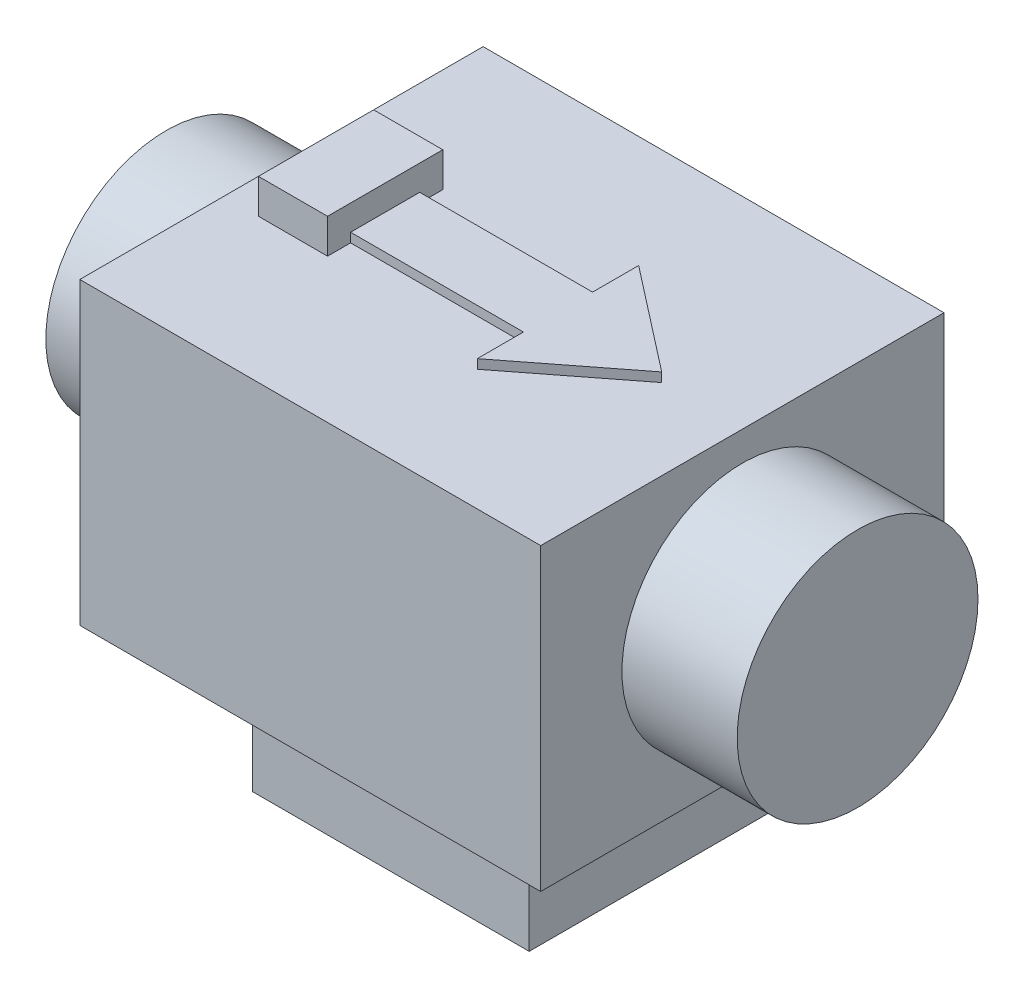
ISO-10303-21;
HEADER;
FILE_DESCRIPTION(('STEP AP214'),'2;1');
FILE_NAME('part.step','',(''),(''),'','','');
FILE_SCHEMA(('AUTOMOTIVE_DESIGN { 1 0 10303 214 1 1 1 1 }'));
ENDSEC;
DATA;
#1=APPLICATION_CONTEXT('core data for automotive mechanical design processes');
#2=APPLICATION_PROTOCOL_DEFINITION('international standard','automotive_design',2000,#1);
#3=PRODUCT_CONTEXT('',#1,'mechanical');
#4=PRODUCT('Part','Part','',(#3));
#5=PRODUCT_RELATED_PRODUCT_CATEGORY('part','',(#4));
#6=PRODUCT_DEFINITION_FORMATION('','',#4);
#7=PRODUCT_DEFINITION_CONTEXT('part definition',#1,'design');
#8=PRODUCT_DEFINITION('design','',#6,#7);
#9=PRODUCT_DEFINITION_SHAPE('','',#8);
#10=(LENGTH_UNIT() NAMED_UNIT(*) SI_UNIT(.MILLI.,.METRE.));
#11=(NAMED_UNIT(*) PLANE_ANGLE_UNIT() SI_UNIT($,.RADIAN.));
#12=(NAMED_UNIT(*) SI_UNIT($,.STERADIAN.) SOLID_ANGLE_UNIT());
#13=UNCERTAINTY_MEASURE_WITH_UNIT(LENGTH_MEASURE(1.E-05),#10,'distance_accuracy_value','');
#14=(GEOMETRIC_REPRESENTATION_CONTEXT(3) GLOBAL_UNCERTAINTY_ASSIGNED_CONTEXT((#13)) GLOBAL_UNIT_ASSIGNED_CONTEXT((#10,
#11,#12)) REPRESENTATION_CONTEXT('',''));
#15=CARTESIAN_POINT('',(0.,0.,0.));
#16=DIRECTION('',(0.,0.,1.));
#17=DIRECTION('',(1.,0.,0.));
#18=AXIS2_PLACEMENT_3D('',#15,#16,#17);
#19=CARTESIAN_POINT('',(0.,38.,0.));
#20=DIRECTION('',(0.,-1.,0.));
#21=DIRECTION('',(0.,0.,-1.));
#22=AXIS2_PLACEMENT_3D('',#19,#20,#21);
#23=PLANE('',#22);
#24=DIRECTION('',(0.,0.,-1.));
#25=VECTOR('',#24,1.);
#26=CARTESIAN_POINT('',(20.,38.,17.5));
#27=LINE('',#26,#25);
#28=CARTESIAN_POINT('',(20.,38.,17.5));
#29=VERTEX_POINT('',#28);
#30=CARTESIAN_POINT('',(20.,38.,-17.5));
#31=VERTEX_POINT('',#30);
#32=EDGE_CURVE('E342',#29,#31,#27,.T.);
#33=ORIENTED_EDGE('',*,*,#32,.T.);
#34=DIRECTION('',(-1.,0.,0.));
#35=VECTOR('',#34,1.);
#36=CARTESIAN_POINT('',(-20.,38.,-17.5));
#37=LINE('',#36,#35);
#38=CARTESIAN_POINT('',(-20.,38.,-17.5));
#39=VERTEX_POINT('',#38);
#40=EDGE_CURVE('E350',#31,#39,#37,.T.);
#41=ORIENTED_EDGE('',*,*,#40,.T.);
#42=DIRECTION('',(0.,0.,1.));
#43=VECTOR('',#42,1.);
#44=CARTESIAN_POINT('',(-20.,38.,17.5));
#45=LINE('',#44,#43);
#46=CARTESIAN_POINT('',(-20.,38.,17.5));
#47=VERTEX_POINT('',#46);
#48=EDGE_CURVE('E351',#39,#47,#45,.T.);
#49=ORIENTED_EDGE('',*,*,#48,.T.);
#50=DIRECTION('',(1.,0.,0.));
#51=VECTOR('',#50,1.);
#52=CARTESIAN_POINT('',(-20.,38.,17.5));
#53=LINE('',#52,#51);
#54=EDGE_CURVE('E353',#47,#29,#53,.T.);
#55=ORIENTED_EDGE('',*,*,#54,.T.);
#56=EDGE_LOOP('',(#33,#41,#49,#55));
#57=FACE_BOUND('',#56,.T.);
#58=DIRECTION('',(0.,0.,-1.));
#59=VECTOR('',#58,1.);
#60=CARTESIAN_POINT('',(-11.,38.,5.));
#61=LINE('',#60,#59);
#62=CARTESIAN_POINT('',(-11.,38.,-3.));
#63=VERTEX_POINT('',#62);
#64=CARTESIAN_POINT('',(-11.,38.,-5.));
#65=VERTEX_POINT('',#64);
#66=EDGE_CURVE('E202',#63,#65,#61,.T.);
#67=ORIENTED_EDGE('',*,*,#66,.F.);
#68=DIRECTION('',(-1.,0.,0.));
#69=VECTOR('',#68,1.);
#70=CARTESIAN_POINT('',(-12.,38.,-3.));
#71=LINE('',#70,#69);
#72=CARTESIAN_POINT('',(4.,38.,-3.));
#73=VERTEX_POINT('',#72);
#74=EDGE_CURVE('E223',#73,#63,#71,.T.);
#75=ORIENTED_EDGE('',*,*,#74,.F.);
#76=DIRECTION('',(0.,0.,1.));
#77=VECTOR('',#76,1.);
#78=CARTESIAN_POINT('',(4.,38.,-3.));
#79=LINE('',#78,#77);
#80=CARTESIAN_POINT('',(4.,38.,-7.));
#81=VERTEX_POINT('',#80);
#82=EDGE_CURVE('E254',#81,#73,#79,.T.);
#83=ORIENTED_EDGE('',*,*,#82,.F.);
#84=DIRECTION('',(-0.789352217376326,0.,-0.61394061351492));
#85=VECTOR('',#84,1.);
#86=CARTESIAN_POINT('',(4.,38.,-7.));
#87=LINE('',#86,#85);
#88=CARTESIAN_POINT('',(13.,38.,0.));
#89=VERTEX_POINT('',#88);
#90=EDGE_CURVE('E253',#89,#81,#87,.T.);
#91=ORIENTED_EDGE('',*,*,#90,.F.);
#92=DIRECTION('',(0.789352217376326,0.,-0.61394061351492));
#93=VECTOR('',#92,1.);
#94=CARTESIAN_POINT('',(13.,38.,0.));
#95=LINE('',#94,#93);
#96=CARTESIAN_POINT('',(4.,38.,7.));
#97=VERTEX_POINT('',#96);
#98=EDGE_CURVE('E250',#97,#89,#95,.T.);
#99=ORIENTED_EDGE('',*,*,#98,.F.);
#100=DIRECTION('',(0.,0.,1.));
#101=VECTOR('',#100,1.);
#102=CARTESIAN_POINT('',(4.,38.,7.));
#103=LINE('',#102,#101);
#104=CARTESIAN_POINT('',(4.,38.,3.));
#105=VERTEX_POINT('',#104);
#106=EDGE_CURVE('E244',#105,#97,#103,.T.);
#107=ORIENTED_EDGE('',*,*,#106,.F.);
#108=DIRECTION('',(1.,0.,0.));
#109=VECTOR('',#108,1.);
#110=CARTESIAN_POINT('',(4.,38.,3.));
#111=LINE('',#110,#109);
#112=CARTESIAN_POINT('',(-11.,38.,3.));
#113=VERTEX_POINT('',#112);
#114=EDGE_CURVE('E219',#113,#105,#111,.T.);
#115=ORIENTED_EDGE('',*,*,#114,.F.);
#116=CARTESIAN_POINT('',(-11.,38.,5.));
#117=VERTEX_POINT('',#116);
#118=EDGE_CURVE('E406',#117,#113,#61,.T.);
#119=ORIENTED_EDGE('',*,*,#118,.F.);
#120=DIRECTION('',(1.,0.,0.));
#121=VECTOR('',#120,1.);
#122=CARTESIAN_POINT('',(-17.,38.,5.));
#123=LINE('',#122,#121);
#124=CARTESIAN_POINT('',(-17.,38.,5.));
#125=VERTEX_POINT('',#124);
#126=EDGE_CURVE('E199',#125,#117,#123,.T.);
#127=ORIENTED_EDGE('',*,*,#126,.F.);
#128=DIRECTION('',(0.,0.,1.));
#129=VECTOR('',#128,1.);
#130=CARTESIAN_POINT('',(-17.,38.,5.));
#131=LINE('',#130,#129);
#132=CARTESIAN_POINT('',(-17.,38.,-5.));
#133=VERTEX_POINT('',#132);
#134=EDGE_CURVE('E69',#133,#125,#131,.T.);
#135=ORIENTED_EDGE('',*,*,#134,.F.);
#136=DIRECTION('',(-1.,0.,0.));
#137=VECTOR('',#136,1.);
#138=CARTESIAN_POINT('',(-17.,38.,-5.));
#139=LINE('',#138,#137);
#140=EDGE_CURVE('E65',#65,#133,#139,.T.);
#141=ORIENTED_EDGE('',*,*,#140,.F.);
#142=EDGE_LOOP('',(#67,#75,#83,#91,#99,#107,#115,#119,#127,#135,#141));
#143=FACE_BOUND('',#142,.T.);
#144=ADVANCED_FACE('F47',(#57,#143),#23,.F.);
#145=CARTESIAN_POINT('',(4.,38.8,3.));
#146=DIRECTION('',(0.,0.,-1.));
#147=DIRECTION('',(-1.,0.,0.));
#148=AXIS2_PLACEMENT_3D('',#145,#146,#147);
#149=PLANE('',#148);
#150=DIRECTION('',(0.,1.,0.));
#151=VECTOR('',#150,1.);
#152=CARTESIAN_POINT('',(-11.,38.8,3.));
#153=LINE('',#152,#151);
#154=CARTESIAN_POINT('',(-11.,38.8,3.));
#155=VERTEX_POINT('',#154);
#156=EDGE_CURVE('E211',#113,#155,#153,.T.);
#157=ORIENTED_EDGE('',*,*,#156,.F.);
#158=ORIENTED_EDGE('',*,*,#114,.T.);
#159=DIRECTION('',(0.,-1.,0.));
#160=VECTOR('',#159,1.);
#161=CARTESIAN_POINT('',(4.,38.8,3.));
#162=LINE('',#161,#160);
#163=CARTESIAN_POINT('',(4.,38.8,3.));
#164=VERTEX_POINT('',#163);
#165=EDGE_CURVE('E280',#164,#105,#162,.T.);
#166=ORIENTED_EDGE('',*,*,#165,.F.);
#167=DIRECTION('',(1.,0.,0.));
#168=VECTOR('',#167,1.);
#169=CARTESIAN_POINT('',(4.,38.8,3.));
#170=LINE('',#169,#168);
#171=EDGE_CURVE('E222',#155,#164,#170,.T.);
#172=ORIENTED_EDGE('',*,*,#171,.F.);
#173=EDGE_LOOP('',(#157,#158,#166,#172));
#174=FACE_BOUND('',#173,.T.);
#175=ADVANCED_FACE('F401',(#174),#149,.F.);
#176=CARTESIAN_POINT('',(-12.,38.8,-3.));
#177=DIRECTION('',(0.,0.,1.));
#178=DIRECTION('',(1.,0.,0.));
#179=AXIS2_PLACEMENT_3D('',#176,#177,#178);
#180=PLANE('',#179);
#181=DIRECTION('',(0.,-1.,0.));
#182=VECTOR('',#181,1.);
#183=CARTESIAN_POINT('',(-11.,38.8,-3.));
#184=LINE('',#183,#182);
#185=CARTESIAN_POINT('',(-11.,38.8,-3.));
#186=VERTEX_POINT('',#185);
#187=EDGE_CURVE('E210',#186,#63,#184,.T.);
#188=ORIENTED_EDGE('',*,*,#187,.F.);
#189=DIRECTION('',(-1.,0.,0.));
#190=VECTOR('',#189,1.);
#191=CARTESIAN_POINT('',(-12.,38.8,-3.));
#192=LINE('',#191,#190);
#193=CARTESIAN_POINT('',(4.,38.8,-3.));
#194=VERTEX_POINT('',#193);
#195=EDGE_CURVE('E240',#194,#186,#192,.T.);
#196=ORIENTED_EDGE('',*,*,#195,.F.);
#197=DIRECTION('',(0.,-1.,0.));
#198=VECTOR('',#197,1.);
#199=CARTESIAN_POINT('',(4.,38.8,-3.));
#200=LINE('',#199,#198);
#201=EDGE_CURVE('E238',#194,#73,#200,.T.);
#202=ORIENTED_EDGE('',*,*,#201,.T.);
#203=ORIENTED_EDGE('',*,*,#74,.T.);
#204=EDGE_LOOP('',(#188,#196,#202,#203));
#205=FACE_BOUND('',#204,.T.);
#206=ADVANCED_FACE('F410',(#205),#180,.F.);
#207=CARTESIAN_POINT('',(0.,38.8,0.));
#208=DIRECTION('',(0.,-1.,0.));
#209=DIRECTION('',(0.,0.,-1.));
#210=AXIS2_PLACEMENT_3D('',#207,#208,#209);
#211=PLANE('',#210);
#212=DIRECTION('',(0.,0.,-1.));
#213=VECTOR('',#212,1.);
#214=CARTESIAN_POINT('',(-11.,38.8,0.));
#215=LINE('',#214,#213);
#216=EDGE_CURVE('E11',#155,#186,#215,.T.);
#217=ORIENTED_EDGE('',*,*,#216,.F.);
#218=ORIENTED_EDGE('',*,*,#171,.T.);
#219=DIRECTION('',(0.,0.,1.));
#220=VECTOR('',#219,1.);
#221=CARTESIAN_POINT('',(4.,38.8,7.));
#222=LINE('',#221,#220);
#223=CARTESIAN_POINT('',(4.,38.8,7.));
#224=VERTEX_POINT('',#223);
#225=EDGE_CURVE('E221',#164,#224,#222,.T.);
#226=ORIENTED_EDGE('',*,*,#225,.T.);
#227=DIRECTION('',(0.789352217376326,0.,-0.61394061351492));
#228=VECTOR('',#227,1.);
#229=CARTESIAN_POINT('',(13.,38.8,0.));
#230=LINE('',#229,#228);
#231=CARTESIAN_POINT('',(13.,38.8,0.));
#232=VERTEX_POINT('',#231);
#233=EDGE_CURVE('E229',#224,#232,#230,.T.);
#234=ORIENTED_EDGE('',*,*,#233,.T.);
#235=DIRECTION('',(-0.789352217376326,0.,-0.61394061351492));
#236=VECTOR('',#235,1.);
#237=CARTESIAN_POINT('',(4.,38.8,-7.));
#238=LINE('',#237,#236);
#239=CARTESIAN_POINT('',(4.,38.8,-7.));
#240=VERTEX_POINT('',#239);
#241=EDGE_CURVE('E231',#232,#240,#238,.T.);
#242=ORIENTED_EDGE('',*,*,#241,.T.);
#243=DIRECTION('',(0.,0.,1.));
#244=VECTOR('',#243,1.);
#245=CARTESIAN_POINT('',(4.,38.8,-3.));
#246=LINE('',#245,#244);
#247=EDGE_CURVE('E233',#240,#194,#246,.T.);
#248=ORIENTED_EDGE('',*,*,#247,.T.);
#249=ORIENTED_EDGE('',*,*,#195,.T.);
#250=EDGE_LOOP('',(#217,#218,#226,#234,#242,#248,#249));
#251=FACE_BOUND('',#250,.T.);
#252=ADVANCED_FACE('F414',(#251),#211,.F.);
#253=CARTESIAN_POINT('',(0.,12.,0.));
#254=DIRECTION('',(0.,-1.,0.));
#255=DIRECTION('',(0.,0.,-1.));
#256=AXIS2_PLACEMENT_3D('',#253,#254,#255);
#257=PLANE('',#256);
#258=DIRECTION('',(0.,0.,-1.));
#259=VECTOR('',#258,1.);
#260=CARTESIAN_POINT('',(20.,12.,17.5));
#261=LINE('',#260,#259);
#262=CARTESIAN_POINT('',(20.,12.,17.5));
#263=VERTEX_POINT('',#262);
#264=CARTESIAN_POINT('',(20.,12.,-17.5));
#265=VERTEX_POINT('',#264);
#266=EDGE_CURVE('E338',#263,#265,#261,.T.);
#267=ORIENTED_EDGE('',*,*,#266,.F.);
#268=DIRECTION('',(1.,0.,0.));
#269=VECTOR('',#268,1.);
#270=CARTESIAN_POINT('',(-20.,12.,17.5));
#271=LINE('',#270,#269);
#272=CARTESIAN_POINT('',(-20.,12.,17.5));
#273=VERTEX_POINT('',#272);
#274=EDGE_CURVE('E346',#273,#263,#271,.T.);
#275=ORIENTED_EDGE('',*,*,#274,.F.);
#276=DIRECTION('',(0.,0.,1.));
#277=VECTOR('',#276,1.);
#278=CARTESIAN_POINT('',(-20.,12.,17.5));
#279=LINE('',#278,#277);
#280=CARTESIAN_POINT('',(-20.,12.,-17.5));
#281=VERTEX_POINT('',#280);
#282=EDGE_CURVE('E365',#281,#273,#279,.T.);
#283=ORIENTED_EDGE('',*,*,#282,.F.);
#284=DIRECTION('',(-1.,0.,0.));
#285=VECTOR('',#284,1.);
#286=CARTESIAN_POINT('',(-20.,12.,-17.5));
#287=LINE('',#286,#285);
#288=EDGE_CURVE('E363',#265,#281,#287,.T.);
#289=ORIENTED_EDGE('',*,*,#288,.F.);
#290=EDGE_LOOP('',(#267,#275,#283,#289));
#291=FACE_BOUND('',#290,.T.);
#292=DIRECTION('',(1.,0.,0.));
#293=VECTOR('',#292,1.);
#294=CARTESIAN_POINT('',(-12.,12.,10.5));
#295=LINE('',#294,#293);
#296=CARTESIAN_POINT('',(-12.,12.,10.5));
#297=VERTEX_POINT('',#296);
#298=CARTESIAN_POINT('',(12.,12.,10.5));
#299=VERTEX_POINT('',#298);
#300=EDGE_CURVE('E293',#297,#299,#295,.T.);
#301=ORIENTED_EDGE('',*,*,#300,.T.);
#302=DIRECTION('',(0.,0.,-1.));
#303=VECTOR('',#302,1.);
#304=CARTESIAN_POINT('',(12.,12.,10.5));
#305=LINE('',#304,#303);
#306=CARTESIAN_POINT('',(12.,12.,-10.5));
#307=VERTEX_POINT('',#306);
#308=EDGE_CURVE('E282',#299,#307,#305,.T.);
#309=ORIENTED_EDGE('',*,*,#308,.T.);
#310=DIRECTION('',(-1.,0.,0.));
#311=VECTOR('',#310,1.);
#312=CARTESIAN_POINT('',(-12.,12.,-10.5));
#313=LINE('',#312,#311);
#314=CARTESIAN_POINT('',(-12.,12.,-10.5));
#315=VERTEX_POINT('',#314);
#316=EDGE_CURVE('E286',#307,#315,#313,.T.);
#317=ORIENTED_EDGE('',*,*,#316,.T.);
#318=DIRECTION('',(0.,0.,1.));
#319=VECTOR('',#318,1.);
#320=CARTESIAN_POINT('',(-12.,12.,10.5));
#321=LINE('',#320,#319);
#322=EDGE_CURVE('E292',#315,#297,#321,.T.);
#323=ORIENTED_EDGE('',*,*,#322,.T.);
#324=EDGE_LOOP('',(#301,#309,#317,#323));
#325=FACE_BOUND('',#324,.T.);
#326=ADVANCED_FACE('F391',(#291,#325),#257,.T.);
#327=CARTESIAN_POINT('',(20.,38.,17.5));
#328=DIRECTION('',(-1.,0.,0.));
#329=DIRECTION('',(0.,0.,1.));
#330=AXIS2_PLACEMENT_3D('',#327,#328,#329);
#331=PLANE('',#330);
#332=CARTESIAN_POINT('',(20.,25.,0.));
#333=DIRECTION('',(1.,0.,0.));
#334=DIRECTION('',(0.,0.,-1.));
#335=AXIS2_PLACEMENT_3D('',#332,#333,#334);
#336=CIRCLE('',#335,10.45);
#337=CARTESIAN_POINT('',(20.,25.,-10.45));
#338=VERTEX_POINT('',#337);
#339=EDGE_CURVE('E59',#338,#338,#336,.T.);
#340=ORIENTED_EDGE('',*,*,#339,.F.);
#341=EDGE_LOOP('',(#340));
#342=FACE_BOUND('',#341,.T.);
#343=ORIENTED_EDGE('',*,*,#266,.T.);
#344=DIRECTION('',(0.,-1.,0.));
#345=VECTOR('',#344,1.);
#346=CARTESIAN_POINT('',(20.,38.,-17.5));
#347=LINE('',#346,#345);
#348=EDGE_CURVE('E331',#31,#265,#347,.T.);
#349=ORIENTED_EDGE('',*,*,#348,.F.);
#350=ORIENTED_EDGE('',*,*,#32,.F.);
#351=DIRECTION('',(0.,-1.,0.));
#352=VECTOR('',#351,1.);
#353=CARTESIAN_POINT('',(20.,38.,17.5));
#354=LINE('',#353,#352);
#355=EDGE_CURVE('E360',#29,#263,#354,.T.);
#356=ORIENTED_EDGE('',*,*,#355,.T.);
#357=EDGE_LOOP('',(#343,#349,#350,#356));
#358=FACE_BOUND('',#357,.T.);
#359=ADVANCED_FACE('F51',(#342,#358),#331,.F.);
#360=CARTESIAN_POINT('',(-20.,38.,-17.5));
#361=DIRECTION('',(0.,0.,1.));
#362=DIRECTION('',(1.,0.,0.));
#363=AXIS2_PLACEMENT_3D('',#360,#361,#362);
#364=PLANE('',#363);
#365=ORIENTED_EDGE('',*,*,#288,.T.);
#366=DIRECTION('',(0.,-1.,0.));
#367=VECTOR('',#366,1.);
#368=CARTESIAN_POINT('',(-20.,38.,-17.5));
#369=LINE('',#368,#367);
#370=EDGE_CURVE('E376',#39,#281,#369,.T.);
#371=ORIENTED_EDGE('',*,*,#370,.F.);
#372=ORIENTED_EDGE('',*,*,#40,.F.);
#373=ORIENTED_EDGE('',*,*,#348,.T.);
#374=EDGE_LOOP('',(#365,#371,#372,#373));
#375=FACE_BOUND('',#374,.T.);
#376=ADVANCED_FACE('F382',(#375),#364,.F.);
#377=CARTESIAN_POINT('',(-20.,38.,17.5));
#378=DIRECTION('',(1.,0.,0.));
#379=DIRECTION('',(0.,0.,-1.));
#380=AXIS2_PLACEMENT_3D('',#377,#378,#379);
#381=PLANE('',#380);
#382=CARTESIAN_POINT('',(-20.,25.,0.));
#383=DIRECTION('',(1.,0.,0.));
#384=DIRECTION('',(0.,0.,-1.));
#385=AXIS2_PLACEMENT_3D('',#382,#383,#384);
#386=CIRCLE('',#385,10.45);
#387=CARTESIAN_POINT('',(-20.,25.,-10.45));
#388=VERTEX_POINT('',#387);
#389=EDGE_CURVE('E333',#388,#388,#386,.T.);
#390=ORIENTED_EDGE('',*,*,#389,.T.);
#391=EDGE_LOOP('',(#390));
#392=FACE_BOUND('',#391,.T.);
#393=ORIENTED_EDGE('',*,*,#282,.T.);
#394=DIRECTION('',(0.,-1.,0.));
#395=VECTOR('',#394,1.);
#396=CARTESIAN_POINT('',(-20.,38.,17.5));
#397=LINE('',#396,#395);
#398=EDGE_CURVE('E375',#47,#273,#397,.T.);
#399=ORIENTED_EDGE('',*,*,#398,.F.);
#400=ORIENTED_EDGE('',*,*,#48,.F.);
#401=ORIENTED_EDGE('',*,*,#370,.T.);
#402=EDGE_LOOP('',(#393,#399,#400,#401));
#403=FACE_BOUND('',#402,.T.);
#404=ADVANCED_FACE('F396',(#392,#403),#381,.F.);
#405=CARTESIAN_POINT('',(-20.,38.,17.5));
#406=DIRECTION('',(0.,0.,-1.));
#407=DIRECTION('',(-1.,0.,0.));
#408=AXIS2_PLACEMENT_3D('',#405,#406,#407);
#409=PLANE('',#408);
#410=ORIENTED_EDGE('',*,*,#274,.T.);
#411=ORIENTED_EDGE('',*,*,#355,.F.);
#412=ORIENTED_EDGE('',*,*,#54,.F.);
#413=ORIENTED_EDGE('',*,*,#398,.T.);
#414=EDGE_LOOP('',(#410,#411,#412,#413));
#415=FACE_BOUND('',#414,.T.);
#416=ADVANCED_FACE('F399',(#415),#409,.F.);
#417=CARTESIAN_POINT('',(-20.,25.,0.));
#418=DIRECTION('',(-1.,0.,0.));
#419=DIRECTION('',(0.,0.,1.));
#420=AXIS2_PLACEMENT_3D('',#417,#418,#419);
#421=CYLINDRICAL_SURFACE('',#420,10.45);
#422=ORIENTED_EDGE('',*,*,#389,.F.);
#423=EDGE_LOOP('',(#422));
#424=FACE_BOUND('',#423,.T.);
#425=CARTESIAN_POINT('',(-30.,25.,0.));
#426=DIRECTION('',(1.,0.,0.));
#427=DIRECTION('',(0.,0.,-1.));
#428=AXIS2_PLACEMENT_3D('',#425,#426,#427);
#429=CIRCLE('',#428,10.45);
#430=CARTESIAN_POINT('',(-30.,25.,-10.45));
#431=VERTEX_POINT('',#430);
#432=EDGE_CURVE('E329',#431,#431,#429,.T.);
#433=ORIENTED_EDGE('',*,*,#432,.T.);
#434=EDGE_LOOP('',(#433));
#435=FACE_BOUND('',#434,.T.);
#436=ADVANCED_FACE('F514',(#424,#435),#421,.T.);
#437=CARTESIAN_POINT('',(-30.,25.,0.));
#438=DIRECTION('',(1.,0.,0.));
#439=DIRECTION('',(0.,0.,-1.));
#440=AXIS2_PLACEMENT_3D('',#437,#438,#439);
#441=PLANE('',#440);
#442=ORIENTED_EDGE('',*,*,#432,.F.);
#443=EDGE_LOOP('',(#442));
#444=FACE_BOUND('',#443,.T.);
#445=ADVANCED_FACE('F509',(#444),#441,.F.);
#446=CARTESIAN_POINT('',(30.,25.,0.));
#447=DIRECTION('',(-1.,0.,0.));
#448=DIRECTION('',(0.,0.,1.));
#449=AXIS2_PLACEMENT_3D('',#446,#447,#448);
#450=CYLINDRICAL_SURFACE('',#449,10.45);
#451=CARTESIAN_POINT('',(30.,25.,0.));
#452=DIRECTION('',(1.,0.,0.));
#453=DIRECTION('',(0.,0.,-1.));
#454=AXIS2_PLACEMENT_3D('',#451,#452,#453);
#455=CIRCLE('',#454,10.45);
#456=CARTESIAN_POINT('',(30.,25.,-10.45));
#457=VERTEX_POINT('',#456);
#458=EDGE_CURVE('E326',#457,#457,#455,.T.);
#459=ORIENTED_EDGE('',*,*,#458,.F.);
#460=EDGE_LOOP('',(#459));
#461=FACE_BOUND('',#460,.T.);
#462=ORIENTED_EDGE('',*,*,#339,.T.);
#463=EDGE_LOOP('',(#462));
#464=FACE_BOUND('',#463,.T.);
#465=ADVANCED_FACE('F506',(#461,#464),#450,.T.);
#466=CARTESIAN_POINT('',(30.,25.,0.));
#467=DIRECTION('',(1.,0.,0.));
#468=DIRECTION('',(0.,0.,-1.));
#469=AXIS2_PLACEMENT_3D('',#466,#467,#468);
#470=PLANE('',#469);
#471=ORIENTED_EDGE('',*,*,#458,.T.);
#472=EDGE_LOOP('',(#471));
#473=FACE_BOUND('',#472,.T.);
#474=ADVANCED_FACE('F502',(#473),#470,.T.);
#475=CARTESIAN_POINT('',(12.,12.,10.5));
#476=DIRECTION('',(-1.,0.,0.));
#477=DIRECTION('',(0.,0.,1.));
#478=AXIS2_PLACEMENT_3D('',#475,#476,#477);
#479=PLANE('',#478);
#480=DIRECTION('',(0.,0.,-1.));
#481=VECTOR('',#480,1.);
#482=CARTESIAN_POINT('',(12.,0.,10.5));
#483=LINE('',#482,#481);
#484=CARTESIAN_POINT('',(12.,0.,10.5));
#485=VERTEX_POINT('',#484);
#486=CARTESIAN_POINT('',(12.,0.,-10.5));
#487=VERTEX_POINT('',#486);
#488=EDGE_CURVE('E281',#485,#487,#483,.T.);
#489=ORIENTED_EDGE('',*,*,#488,.T.);
#490=DIRECTION('',(0.,-1.,0.));
#491=VECTOR('',#490,1.);
#492=CARTESIAN_POINT('',(12.,12.,-10.5));
#493=LINE('',#492,#491);
#494=EDGE_CURVE('E325',#307,#487,#493,.T.);
#495=ORIENTED_EDGE('',*,*,#494,.F.);
#496=ORIENTED_EDGE('',*,*,#308,.F.);
#497=DIRECTION('',(0.,-1.,0.));
#498=VECTOR('',#497,1.);
#499=CARTESIAN_POINT('',(12.,12.,10.5));
#500=LINE('',#499,#498);
#501=EDGE_CURVE('E298',#299,#485,#500,.T.);
#502=ORIENTED_EDGE('',*,*,#501,.T.);
#503=EDGE_LOOP('',(#489,#495,#496,#502));
#504=FACE_BOUND('',#503,.T.);
#505=ADVANCED_FACE('F499',(#504),#479,.F.);
#506=CARTESIAN_POINT('',(-12.,12.,-10.5));
#507=DIRECTION('',(0.,0.,1.));
#508=DIRECTION('',(1.,0.,0.));
#509=AXIS2_PLACEMENT_3D('',#506,#507,#508);
#510=PLANE('',#509);
#511=DIRECTION('',(-1.,0.,0.));
#512=VECTOR('',#511,1.);
#513=CARTESIAN_POINT('',(-12.,0.,-10.5));
#514=LINE('',#513,#512);
#515=CARTESIAN_POINT('',(-12.,0.,-10.5));
#516=VERTEX_POINT('',#515);
#517=EDGE_CURVE('E302',#487,#516,#514,.T.);
#518=ORIENTED_EDGE('',*,*,#517,.T.);
#519=DIRECTION('',(0.,-1.,0.));
#520=VECTOR('',#519,1.);
#521=CARTESIAN_POINT('',(-12.,12.,-10.5));
#522=LINE('',#521,#520);
#523=EDGE_CURVE('E318',#315,#516,#522,.T.);
#524=ORIENTED_EDGE('',*,*,#523,.F.);
#525=ORIENTED_EDGE('',*,*,#316,.F.);
#526=ORIENTED_EDGE('',*,*,#494,.T.);
#527=EDGE_LOOP('',(#518,#524,#525,#526));
#528=FACE_BOUND('',#527,.T.);
#529=ADVANCED_FACE('F493',(#528),#510,.F.);
#530=CARTESIAN_POINT('',(-12.,12.,10.5));
#531=DIRECTION('',(1.,0.,0.));
#532=DIRECTION('',(0.,0.,-1.));
#533=AXIS2_PLACEMENT_3D('',#530,#531,#532);
#534=PLANE('',#533);
#535=DIRECTION('',(0.,0.,1.));
#536=VECTOR('',#535,1.);
#537=CARTESIAN_POINT('',(-12.,0.,10.5));
#538=LINE('',#537,#536);
#539=CARTESIAN_POINT('',(-12.,0.,10.5));
#540=VERTEX_POINT('',#539);
#541=EDGE_CURVE('E308',#516,#540,#538,.T.);
#542=ORIENTED_EDGE('',*,*,#541,.T.);
#543=DIRECTION('',(0.,-1.,0.));
#544=VECTOR('',#543,1.);
#545=CARTESIAN_POINT('',(-12.,12.,10.5));
#546=LINE('',#545,#544);
#547=EDGE_CURVE('E314',#297,#540,#546,.T.);
#548=ORIENTED_EDGE('',*,*,#547,.F.);
#549=ORIENTED_EDGE('',*,*,#322,.F.);
#550=ORIENTED_EDGE('',*,*,#523,.T.);
#551=EDGE_LOOP('',(#542,#548,#549,#550));
#552=FACE_BOUND('',#551,.T.);
#553=ADVANCED_FACE('F489',(#552),#534,.F.);
#554=CARTESIAN_POINT('',(-12.,12.,10.5));
#555=DIRECTION('',(0.,0.,-1.));
#556=DIRECTION('',(-1.,0.,0.));
#557=AXIS2_PLACEMENT_3D('',#554,#555,#556);
#558=PLANE('',#557);
#559=DIRECTION('',(1.,0.,0.));
#560=VECTOR('',#559,1.);
#561=CARTESIAN_POINT('',(-12.,0.,10.5));
#562=LINE('',#561,#560);
#563=EDGE_CURVE('E290',#540,#485,#562,.T.);
#564=ORIENTED_EDGE('',*,*,#563,.T.);
#565=ORIENTED_EDGE('',*,*,#501,.F.);
#566=ORIENTED_EDGE('',*,*,#300,.F.);
#567=ORIENTED_EDGE('',*,*,#547,.T.);
#568=EDGE_LOOP('',(#564,#565,#566,#567));
#569=FACE_BOUND('',#568,.T.);
#570=ADVANCED_FACE('F486',(#569),#558,.F.);
#571=CARTESIAN_POINT('',(0.,0.,0.));
#572=DIRECTION('',(0.,-1.,0.));
#573=DIRECTION('',(0.,0.,-1.));
#574=AXIS2_PLACEMENT_3D('',#571,#572,#573);
#575=PLANE('',#574);
#576=ORIENTED_EDGE('',*,*,#488,.F.);
#577=ORIENTED_EDGE('',*,*,#563,.F.);
#578=ORIENTED_EDGE('',*,*,#541,.F.);
#579=ORIENTED_EDGE('',*,*,#517,.F.);
#580=EDGE_LOOP('',(#576,#577,#578,#579));
#581=FACE_BOUND('',#580,.T.);
#582=ADVANCED_FACE('F481',(#581),#575,.T.);
#583=CARTESIAN_POINT('',(4.,38.8,7.));
#584=DIRECTION('',(1.,0.,0.));
#585=DIRECTION('',(0.,0.,-1.));
#586=AXIS2_PLACEMENT_3D('',#583,#584,#585);
#587=PLANE('',#586);
#588=ORIENTED_EDGE('',*,*,#106,.T.);
#589=DIRECTION('',(0.,-1.,0.));
#590=VECTOR('',#589,1.);
#591=CARTESIAN_POINT('',(4.,38.8,7.));
#592=LINE('',#591,#590);
#593=EDGE_CURVE('E272',#224,#97,#592,.T.);
#594=ORIENTED_EDGE('',*,*,#593,.F.);
#595=ORIENTED_EDGE('',*,*,#225,.F.);
#596=ORIENTED_EDGE('',*,*,#165,.T.);
#597=EDGE_LOOP('',(#588,#594,#595,#596));
#598=FACE_BOUND('',#597,.T.);
#599=ADVANCED_FACE('F421',(#598),#587,.F.);
#600=CARTESIAN_POINT('',(13.,38.8,0.));
#601=DIRECTION('',(-0.61394061351492,0.,-0.789352217376326));
#602=DIRECTION('',(-0.789352217376326,0.,0.61394061351492));
#603=AXIS2_PLACEMENT_3D('',#600,#601,#602);
#604=PLANE('',#603);
#605=ORIENTED_EDGE('',*,*,#98,.T.);
#606=DIRECTION('',(0.,-1.,0.));
#607=VECTOR('',#606,1.);
#608=CARTESIAN_POINT('',(13.,38.8,0.));
#609=LINE('',#608,#607);
#610=EDGE_CURVE('E267',#232,#89,#609,.T.);
#611=ORIENTED_EDGE('',*,*,#610,.F.);
#612=ORIENTED_EDGE('',*,*,#233,.F.);
#613=ORIENTED_EDGE('',*,*,#593,.T.);
#614=EDGE_LOOP('',(#605,#611,#612,#613));
#615=FACE_BOUND('',#614,.T.);
#616=ADVANCED_FACE('F427',(#615),#604,.F.);
#617=CARTESIAN_POINT('',(4.,38.8,-7.));
#618=DIRECTION('',(-0.61394061351492,0.,0.789352217376326));
#619=DIRECTION('',(0.789352217376326,0.,0.61394061351492));
#620=AXIS2_PLACEMENT_3D('',#617,#618,#619);
#621=PLANE('',#620);
#622=ORIENTED_EDGE('',*,*,#90,.T.);
#623=DIRECTION('',(0.,-1.,0.));
#624=VECTOR('',#623,1.);
#625=CARTESIAN_POINT('',(4.,38.8,-7.));
#626=LINE('',#625,#624);
#627=EDGE_CURVE('E264',#240,#81,#626,.T.);
#628=ORIENTED_EDGE('',*,*,#627,.F.);
#629=ORIENTED_EDGE('',*,*,#241,.F.);
#630=ORIENTED_EDGE('',*,*,#610,.T.);
#631=EDGE_LOOP('',(#622,#628,#629,#630));
#632=FACE_BOUND('',#631,.T.);
#633=ADVANCED_FACE('F431',(#632),#621,.F.);
#634=CARTESIAN_POINT('',(4.,38.8,-3.));
#635=DIRECTION('',(1.,0.,0.));
#636=DIRECTION('',(0.,0.,-1.));
#637=AXIS2_PLACEMENT_3D('',#634,#635,#636);
#638=PLANE('',#637);
#639=ORIENTED_EDGE('',*,*,#82,.T.);
#640=ORIENTED_EDGE('',*,*,#201,.F.);
#641=ORIENTED_EDGE('',*,*,#247,.F.);
#642=ORIENTED_EDGE('',*,*,#627,.T.);
#643=EDGE_LOOP('',(#639,#640,#641,#642));
#644=FACE_BOUND('',#643,.T.);
#645=ADVANCED_FACE('F432',(#644),#638,.F.);
#646=CARTESIAN_POINT('',(-11.,41.,5.));
#647=DIRECTION('',(-1.,0.,0.));
#648=DIRECTION('',(0.,0.,1.));
#649=AXIS2_PLACEMENT_3D('',#646,#647,#648);
#650=PLANE('',#649);
#651=ORIENTED_EDGE('',*,*,#118,.T.);
#652=ORIENTED_EDGE('',*,*,#156,.T.);
#653=ORIENTED_EDGE('',*,*,#216,.T.);
#654=ORIENTED_EDGE('',*,*,#187,.T.);
#655=ORIENTED_EDGE('',*,*,#66,.T.);
#656=DIRECTION('',(0.,-1.,0.));
#657=VECTOR('',#656,1.);
#658=CARTESIAN_POINT('',(-11.,41.,-5.));
#659=LINE('',#658,#657);
#660=CARTESIAN_POINT('',(-11.,41.,-5.));
#661=VERTEX_POINT('',#660);
#662=EDGE_CURVE('E181',#661,#65,#659,.T.);
#663=ORIENTED_EDGE('',*,*,#662,.F.);
#664=DIRECTION('',(0.,0.,-1.));
#665=VECTOR('',#664,1.);
#666=CARTESIAN_POINT('',(-11.,41.,5.));
#667=LINE('',#666,#665);
#668=CARTESIAN_POINT('',(-11.,41.,5.));
#669=VERTEX_POINT('',#668);
#670=EDGE_CURVE('E190',#669,#661,#667,.T.);
#671=ORIENTED_EDGE('',*,*,#670,.F.);
#672=DIRECTION('',(0.,-1.,0.));
#673=VECTOR('',#672,1.);
#674=CARTESIAN_POINT('',(-11.,41.,5.));
#675=LINE('',#674,#673);
#676=EDGE_CURVE('E436',#669,#117,#675,.T.);
#677=ORIENTED_EDGE('',*,*,#676,.T.);
#678=EDGE_LOOP('',(#651,#652,#653,#654,#655,#663,#671,#677));
#679=FACE_BOUND('',#678,.T.);
#680=ADVANCED_FACE('F201',(#679),#650,.F.);
#681=CARTESIAN_POINT('',(-17.,41.,-5.));
#682=DIRECTION('',(0.,0.,1.));
#683=DIRECTION('',(1.,0.,0.));
#684=AXIS2_PLACEMENT_3D('',#681,#682,#683);
#685=PLANE('',#684);
#686=ORIENTED_EDGE('',*,*,#140,.T.);
#687=DIRECTION('',(0.,-1.,0.));
#688=VECTOR('',#687,1.);
#689=CARTESIAN_POINT('',(-17.,41.,-5.));
#690=LINE('',#689,#688);
#691=CARTESIAN_POINT('',(-17.,41.,-5.));
#692=VERTEX_POINT('',#691);
#693=EDGE_CURVE('E183',#692,#133,#690,.T.);
#694=ORIENTED_EDGE('',*,*,#693,.F.);
#695=DIRECTION('',(-1.,0.,0.));
#696=VECTOR('',#695,1.);
#697=CARTESIAN_POINT('',(-17.,41.,-5.));
#698=LINE('',#697,#696);
#699=EDGE_CURVE('E178',#661,#692,#698,.T.);
#700=ORIENTED_EDGE('',*,*,#699,.F.);
#701=ORIENTED_EDGE('',*,*,#662,.T.);
#702=EDGE_LOOP('',(#686,#694,#700,#701));
#703=FACE_BOUND('',#702,.T.);
#704=ADVANCED_FACE('F182',(#703),#685,.F.);
#705=CARTESIAN_POINT('',(-17.,41.,5.));
#706=DIRECTION('',(1.,0.,0.));
#707=DIRECTION('',(0.,0.,-1.));
#708=AXIS2_PLACEMENT_3D('',#705,#706,#707);
#709=PLANE('',#708);
#710=ORIENTED_EDGE('',*,*,#134,.T.);
#711=DIRECTION('',(0.,-1.,0.));
#712=VECTOR('',#711,1.);
#713=CARTESIAN_POINT('',(-17.,41.,5.));
#714=LINE('',#713,#712);
#715=CARTESIAN_POINT('',(-17.,41.,5.));
#716=VERTEX_POINT('',#715);
#717=EDGE_CURVE('E213',#716,#125,#714,.T.);
#718=ORIENTED_EDGE('',*,*,#717,.F.);
#719=DIRECTION('',(0.,0.,1.));
#720=VECTOR('',#719,1.);
#721=CARTESIAN_POINT('',(-17.,41.,5.));
#722=LINE('',#721,#720);
#723=EDGE_CURVE('E188',#692,#716,#722,.T.);
#724=ORIENTED_EDGE('',*,*,#723,.F.);
#725=ORIENTED_EDGE('',*,*,#693,.T.);
#726=EDGE_LOOP('',(#710,#718,#724,#725));
#727=FACE_BOUND('',#726,.T.);
#728=ADVANCED_FACE('F453',(#727),#709,.F.);
#729=CARTESIAN_POINT('',(-17.,41.,5.));
#730=DIRECTION('',(0.,0.,-1.));
#731=DIRECTION('',(-1.,0.,0.));
#732=AXIS2_PLACEMENT_3D('',#729,#730,#731);
#733=PLANE('',#732);
#734=ORIENTED_EDGE('',*,*,#126,.T.);
#735=ORIENTED_EDGE('',*,*,#676,.F.);
#736=DIRECTION('',(1.,0.,0.));
#737=VECTOR('',#736,1.);
#738=CARTESIAN_POINT('',(-17.,41.,5.));
#739=LINE('',#738,#737);
#740=EDGE_CURVE('E194',#716,#669,#739,.T.);
#741=ORIENTED_EDGE('',*,*,#740,.F.);
#742=ORIENTED_EDGE('',*,*,#717,.T.);
#743=EDGE_LOOP('',(#734,#735,#741,#742));
#744=FACE_BOUND('',#743,.T.);
#745=ADVANCED_FACE('F455',(#744),#733,.F.);
#746=CARTESIAN_POINT('',(0.,41.,0.));
#747=DIRECTION('',(0.,-1.,0.));
#748=DIRECTION('',(0.,0.,-1.));
#749=AXIS2_PLACEMENT_3D('',#746,#747,#748);
#750=PLANE('',#749);
#751=ORIENTED_EDGE('',*,*,#670,.T.);
#752=ORIENTED_EDGE('',*,*,#699,.T.);
#753=ORIENTED_EDGE('',*,*,#723,.T.);
#754=ORIENTED_EDGE('',*,*,#740,.T.);
#755=EDGE_LOOP('',(#751,#752,#753,#754));
#756=FACE_BOUND('',#755,.T.);
#757=ADVANCED_FACE('F192',(#756),#750,.F.);
#758=CLOSED_SHELL('',(#144,#175,#206,#252,#326,#359,#376,#404,#416,#436,#445,#465,#474,#505,
#529,#553,#570,#582,#599,#616,#633,#645,#680,#704,#728,#745,#757));
#759=MANIFOLD_SOLID_BREP('B2',#758);
#760=ADVANCED_BREP_SHAPE_REPRESENTATION('',(#18,#759),#14);
#761=SHAPE_DEFINITION_REPRESENTATION(#9,#760);
ENDSEC;
END-ISO-10303-21;
